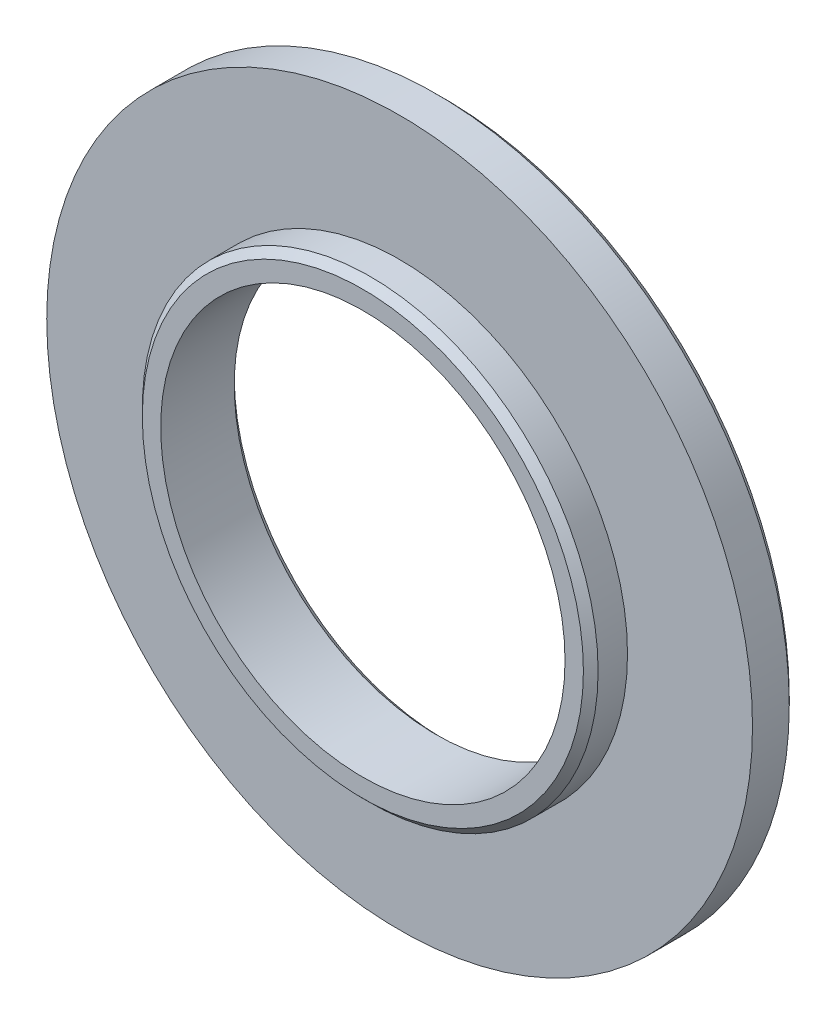
ISO-10303-21;
HEADER;
FILE_DESCRIPTION(('STEP AP214'),'2;1');
FILE_NAME('part.step','',(''),(''),'','','');
FILE_SCHEMA(('AUTOMOTIVE_DESIGN { 1 0 10303 214 1 1 1 1 }'));
ENDSEC;
DATA;
#1=APPLICATION_CONTEXT('core data for automotive mechanical design processes');
#2=APPLICATION_PROTOCOL_DEFINITION('international standard','automotive_design',2000,#1);
#3=PRODUCT_CONTEXT('',#1,'mechanical');
#4=PRODUCT('Part','Part','',(#3));
#5=PRODUCT_RELATED_PRODUCT_CATEGORY('part','',(#4));
#6=PRODUCT_DEFINITION_FORMATION('','',#4);
#7=PRODUCT_DEFINITION_CONTEXT('part definition',#1,'design');
#8=PRODUCT_DEFINITION('design','',#6,#7);
#9=PRODUCT_DEFINITION_SHAPE('','',#8);
#10=(LENGTH_UNIT() NAMED_UNIT(*) SI_UNIT(.MILLI.,.METRE.));
#11=(NAMED_UNIT(*) PLANE_ANGLE_UNIT() SI_UNIT($,.RADIAN.));
#12=(NAMED_UNIT(*) SI_UNIT($,.STERADIAN.) SOLID_ANGLE_UNIT());
#13=UNCERTAINTY_MEASURE_WITH_UNIT(LENGTH_MEASURE(1.E-05),#10,'distance_accuracy_value','');
#14=(GEOMETRIC_REPRESENTATION_CONTEXT(3) GLOBAL_UNCERTAINTY_ASSIGNED_CONTEXT((#13)) GLOBAL_UNIT_ASSIGNED_CONTEXT((#10,
#11,#12)) REPRESENTATION_CONTEXT('',''));
#15=CARTESIAN_POINT('',(0.,0.,0.));
#16=DIRECTION('',(0.,0.,1.));
#17=DIRECTION('',(1.,0.,0.));
#18=AXIS2_PLACEMENT_3D('',#15,#16,#17);
#19=CARTESIAN_POINT('',(0.,0.,6.));
#20=DIRECTION('',(0.,0.,1.));
#21=DIRECTION('',(1.,0.,0.));
#22=AXIS2_PLACEMENT_3D('',#19,#20,#21);
#23=PLANE('',#22);
#24=CARTESIAN_POINT('',(0.,0.,6.));
#25=DIRECTION('',(0.,0.,1.));
#26=DIRECTION('',(1.,0.,0.));
#27=AXIS2_PLACEMENT_3D('',#24,#25,#26);
#28=CIRCLE('',#27,48.);
#29=CARTESIAN_POINT('',(48.,0.,6.));
#30=VERTEX_POINT('',#29);
#31=EDGE_CURVE('E54',#30,#30,#28,.T.);
#32=ORIENTED_EDGE('',*,*,#31,.T.);
#33=EDGE_LOOP('',(#32));
#34=FACE_BOUND('',#33,.T.);
#35=CARTESIAN_POINT('',(0.,0.,6.));
#36=DIRECTION('',(0.,0.,1.));
#37=DIRECTION('',(1.,0.,0.));
#38=AXIS2_PLACEMENT_3D('',#35,#36,#37);
#39=CIRCLE('',#38,31.);
#40=CARTESIAN_POINT('',(31.,0.,6.));
#41=VERTEX_POINT('',#40);
#42=EDGE_CURVE('E57',#41,#41,#39,.T.);
#43=ORIENTED_EDGE('',*,*,#42,.F.);
#44=EDGE_LOOP('',(#43));
#45=FACE_BOUND('',#44,.T.);
#46=ADVANCED_FACE('F28',(#34,#45),#23,.T.);
#47=CARTESIAN_POINT('',(0.,0.,6.));
#48=DIRECTION('',(0.,0.,-1.));
#49=DIRECTION('',(-1.,0.,0.));
#50=AXIS2_PLACEMENT_3D('',#47,#48,#49);
#51=CYLINDRICAL_SURFACE('',#50,48.);
#52=CARTESIAN_POINT('',(0.,0.,0.999999999999987));
#53=DIRECTION('',(0.,0.,1.));
#54=DIRECTION('',(1.,0.,0.));
#55=AXIS2_PLACEMENT_3D('',#52,#53,#54);
#56=CIRCLE('',#55,48.);
#57=CARTESIAN_POINT('',(48.,0.,0.999999999999987));
#58=VERTEX_POINT('',#57);
#59=EDGE_CURVE('E51',#58,#58,#56,.T.);
#60=ORIENTED_EDGE('',*,*,#59,.T.);
#61=EDGE_LOOP('',(#60));
#62=FACE_BOUND('',#61,.T.);
#63=ORIENTED_EDGE('',*,*,#31,.F.);
#64=EDGE_LOOP('',(#63));
#65=FACE_BOUND('',#64,.T.);
#66=ADVANCED_FACE('F86',(#62,#65),#51,.T.);
#67=CARTESIAN_POINT('',(0.,0.,0.));
#68=DIRECTION('',(0.,0.,1.));
#69=DIRECTION('',(1.,0.,0.));
#70=AXIS2_PLACEMENT_3D('',#67,#68,#69);
#71=PLANE('',#70);
#72=CARTESIAN_POINT('',(0.,0.,0.));
#73=DIRECTION('',(0.,0.,1.));
#74=DIRECTION('',(1.,0.,0.));
#75=AXIS2_PLACEMENT_3D('',#72,#73,#74);
#76=CIRCLE('',#75,28.5);
#77=CARTESIAN_POINT('',(28.5,0.,0.));
#78=VERTEX_POINT('',#77);
#79=EDGE_CURVE('E35',#78,#78,#76,.T.);
#80=ORIENTED_EDGE('',*,*,#79,.T.);
#81=EDGE_LOOP('',(#80));
#82=FACE_BOUND('',#81,.T.);
#83=CARTESIAN_POINT('',(0.,0.,0.));
#84=DIRECTION('',(0.,0.,1.));
#85=DIRECTION('',(1.,0.,0.));
#86=AXIS2_PLACEMENT_3D('',#83,#84,#85);
#87=CIRCLE('',#86,47.);
#88=CARTESIAN_POINT('',(47.,0.,0.));
#89=VERTEX_POINT('',#88);
#90=EDGE_CURVE('E48',#89,#89,#87,.F.);
#91=ORIENTED_EDGE('',*,*,#90,.T.);
#92=EDGE_LOOP('',(#91));
#93=FACE_BOUND('',#92,.T.);
#94=ADVANCED_FACE('F92',(#82,#93),#71,.F.);
#95=CARTESIAN_POINT('',(0.,0.,11.));
#96=DIRECTION('',(0.,0.,-1.));
#97=DIRECTION('',(-1.,0.,0.));
#98=AXIS2_PLACEMENT_3D('',#95,#96,#97);
#99=CYLINDRICAL_SURFACE('',#98,31.);
#100=CARTESIAN_POINT('',(0.,0.,10.));
#101=DIRECTION('',(0.,0.,1.));
#102=DIRECTION('',(1.,0.,0.));
#103=AXIS2_PLACEMENT_3D('',#100,#101,#102);
#104=CIRCLE('',#103,31.);
#105=CARTESIAN_POINT('',(31.,0.,10.));
#106=VERTEX_POINT('',#105);
#107=EDGE_CURVE('E39',#106,#106,#104,.F.);
#108=ORIENTED_EDGE('',*,*,#107,.T.);
#109=EDGE_LOOP('',(#108));
#110=FACE_BOUND('',#109,.T.);
#111=ORIENTED_EDGE('',*,*,#42,.T.);
#112=EDGE_LOOP('',(#111));
#113=FACE_BOUND('',#112,.T.);
#114=ADVANCED_FACE('F70',(#110,#113),#99,.T.);
#115=CARTESIAN_POINT('',(0.,0.,11.));
#116=DIRECTION('',(0.,0.,1.));
#117=DIRECTION('',(1.,0.,0.));
#118=AXIS2_PLACEMENT_3D('',#115,#116,#117);
#119=PLANE('',#118);
#120=CARTESIAN_POINT('',(0.,0.,11.));
#121=DIRECTION('',(0.,0.,1.));
#122=DIRECTION('',(1.,0.,0.));
#123=AXIS2_PLACEMENT_3D('',#120,#121,#122);
#124=CIRCLE('',#123,27.5);
#125=CARTESIAN_POINT('',(27.5,0.,11.));
#126=VERTEX_POINT('',#125);
#127=EDGE_CURVE('E60',#126,#126,#124,.T.);
#128=ORIENTED_EDGE('',*,*,#127,.F.);
#129=EDGE_LOOP('',(#128));
#130=FACE_BOUND('',#129,.T.);
#131=CARTESIAN_POINT('',(0.,0.,11.));
#132=DIRECTION('',(0.,0.,1.));
#133=DIRECTION('',(1.,0.,0.));
#134=AXIS2_PLACEMENT_3D('',#131,#132,#133);
#135=CIRCLE('',#134,30.);
#136=CARTESIAN_POINT('',(30.,0.,11.));
#137=VERTEX_POINT('',#136);
#138=EDGE_CURVE('E43',#137,#137,#135,.T.);
#139=ORIENTED_EDGE('',*,*,#138,.T.);
#140=EDGE_LOOP('',(#139));
#141=FACE_BOUND('',#140,.T.);
#142=ADVANCED_FACE('F66',(#130,#141),#119,.T.);
#143=CARTESIAN_POINT('',(0.,0.,0.999999999999987));
#144=DIRECTION('',(0.,0.,1.));
#145=DIRECTION('',(1.,0.,0.));
#146=AXIS2_PLACEMENT_3D('',#143,#144,#145);
#147=CONICAL_SURFACE('',#146,48.,0.785398163397448);
#148=ORIENTED_EDGE('',*,*,#90,.F.);
#149=EDGE_LOOP('',(#148));
#150=FACE_BOUND('',#149,.T.);
#151=ORIENTED_EDGE('',*,*,#59,.F.);
#152=EDGE_LOOP('',(#151));
#153=FACE_BOUND('',#152,.T.);
#154=ADVANCED_FACE('F69',(#150,#153),#147,.T.);
#155=CARTESIAN_POINT('',(0.,0.,11.));
#156=DIRECTION('',(0.,0.,-1.));
#157=DIRECTION('',(-1.,0.,0.));
#158=AXIS2_PLACEMENT_3D('',#155,#156,#157);
#159=CONICAL_SURFACE('',#158,30.,0.785398163397459);
#160=ORIENTED_EDGE('',*,*,#107,.F.);
#161=EDGE_LOOP('',(#160));
#162=FACE_BOUND('',#161,.T.);
#163=ORIENTED_EDGE('',*,*,#138,.F.);
#164=EDGE_LOOP('',(#163));
#165=FACE_BOUND('',#164,.T.);
#166=ADVANCED_FACE('F74',(#162,#165),#159,.T.);
#167=CARTESIAN_POINT('',(0.,0.,0.));
#168=DIRECTION('',(0.,0.,1.));
#169=DIRECTION('',(1.,0.,0.));
#170=AXIS2_PLACEMENT_3D('',#167,#168,#169);
#171=CYLINDRICAL_SURFACE('',#170,27.5);
#172=CARTESIAN_POINT('',(0.,0.,1.));
#173=DIRECTION('',(0.,0.,1.));
#174=DIRECTION('',(1.,0.,0.));
#175=AXIS2_PLACEMENT_3D('',#172,#173,#174);
#176=CIRCLE('',#175,27.5);
#177=CARTESIAN_POINT('',(27.5,0.,1.));
#178=VERTEX_POINT('',#177);
#179=EDGE_CURVE('E10',#178,#178,#176,.F.);
#180=ORIENTED_EDGE('',*,*,#179,.T.);
#181=EDGE_LOOP('',(#180));
#182=FACE_BOUND('',#181,.T.);
#183=ORIENTED_EDGE('',*,*,#127,.T.);
#184=EDGE_LOOP('',(#183));
#185=FACE_BOUND('',#184,.T.);
#186=ADVANCED_FACE('F64',(#182,#185),#171,.F.);
#187=CARTESIAN_POINT('',(0.,0.,0.));
#188=DIRECTION('',(0.,0.,-1.));
#189=DIRECTION('',(-1.,0.,0.));
#190=AXIS2_PLACEMENT_3D('',#187,#188,#189);
#191=CONICAL_SURFACE('',#190,28.5,0.785398163397445);
#192=ORIENTED_EDGE('',*,*,#179,.F.);
#193=EDGE_LOOP('',(#192));
#194=FACE_BOUND('',#193,.T.);
#195=ORIENTED_EDGE('',*,*,#79,.F.);
#196=EDGE_LOOP('',(#195));
#197=FACE_BOUND('',#196,.T.);
#198=ADVANCED_FACE('F30',(#194,#197),#191,.F.);
#199=CLOSED_SHELL('',(#46,#66,#94,#114,#142,#154,#166,#186,#198));
#200=MANIFOLD_SOLID_BREP('B2',#199);
#201=ADVANCED_BREP_SHAPE_REPRESENTATION('',(#18,#200),#14);
#202=SHAPE_DEFINITION_REPRESENTATION(#9,#201);
ENDSEC;
END-ISO-10303-21;
